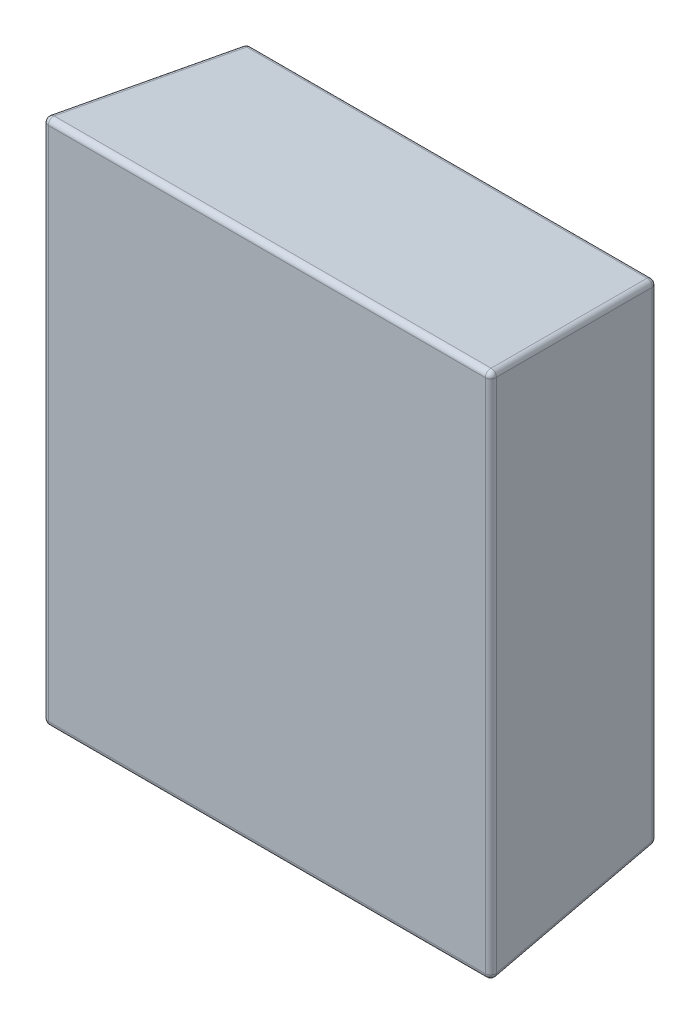
ISO-10303-21;
HEADER;
FILE_DESCRIPTION(('STEP AP214'),'2;1');
FILE_NAME('part.step','',(''),(''),'','','');
FILE_SCHEMA(('AUTOMOTIVE_DESIGN { 1 0 10303 214 1 1 1 1 }'));
ENDSEC;
DATA;
#1=APPLICATION_CONTEXT('core data for automotive mechanical design processes');
#2=APPLICATION_PROTOCOL_DEFINITION('international standard','automotive_design',2000,#1);
#3=PRODUCT_CONTEXT('',#1,'mechanical');
#4=PRODUCT('Part','Part','',(#3));
#5=PRODUCT_RELATED_PRODUCT_CATEGORY('part','',(#4));
#6=PRODUCT_DEFINITION_FORMATION('','',#4);
#7=PRODUCT_DEFINITION_CONTEXT('part definition',#1,'design');
#8=PRODUCT_DEFINITION('design','',#6,#7);
#9=PRODUCT_DEFINITION_SHAPE('','',#8);
#10=(LENGTH_UNIT() NAMED_UNIT(*) SI_UNIT(.MILLI.,.METRE.));
#11=(NAMED_UNIT(*) PLANE_ANGLE_UNIT() SI_UNIT($,.RADIAN.));
#12=(NAMED_UNIT(*) SI_UNIT($,.STERADIAN.) SOLID_ANGLE_UNIT());
#13=UNCERTAINTY_MEASURE_WITH_UNIT(LENGTH_MEASURE(1.E-05),#10,'distance_accuracy_value','');
#14=(GEOMETRIC_REPRESENTATION_CONTEXT(3) GLOBAL_UNCERTAINTY_ASSIGNED_CONTEXT((#13)) GLOBAL_UNIT_ASSIGNED_CONTEXT((#10,
#11,#12)) REPRESENTATION_CONTEXT('',''));
#15=CARTESIAN_POINT('',(0.,0.,0.));
#16=DIRECTION('',(0.,0.,1.));
#17=DIRECTION('',(1.,0.,0.));
#18=AXIS2_PLACEMENT_3D('',#15,#16,#17);
#19=CARTESIAN_POINT('',(26.6055354697207,-0.0356973900736135,-0.664999025911949));
#20=DIRECTION('',(0.,8.74227339409095E-08,-1.));
#21=DIRECTION('',(1.,0.,0.));
#22=AXIS2_PLACEMENT_3D('',#19,#20,#21);
#23=PLANE('',#22);
#24=CARTESIAN_POINT('',(26.6055354697207,-0.0356973900736135,-0.664999025911949));
#25=DIRECTION('',(0.,8.74227339409095E-08,-1.));
#26=DIRECTION('',(1.,0.,0.));
#27=AXIS2_PLACEMENT_3D('',#24,#25,#26);
#28=CIRCLE('',#27,0.10625);
#29=CARTESIAN_POINT('',(26.7117854697207,-0.0356973900736135,-0.664999025911949));
#30=VERTEX_POINT('',#29);
#31=EDGE_CURVE('E20',#30,#30,#28,.T.);
#32=ORIENTED_EDGE('',*,*,#31,.T.);
#33=EDGE_LOOP('',(#32));
#34=FACE_BOUND('',#33,.T.);
#35=ADVANCED_FACE('F17',(#34),#23,.T.);
#36=CARTESIAN_POINT('',(27.9306210908157,1.58938823233279,-0.679998883842521));
#37=DIRECTION('',(0.,-8.74227249203474E-08,1.));
#38=DIRECTION('',(1.,0.,0.));
#39=AXIS2_PLACEMENT_3D('',#36,#37,#38);
#40=SPHERICAL_SURFACE('',#39,0.02);
#41=CARTESIAN_POINT('',(27.9306210908157,1.58938823233279,-0.679998883842521));
#42=DIRECTION('',(0.,-1.,-8.74227249203474E-08));
#43=DIRECTION('',(1.,0.,0.));
#44=AXIS2_PLACEMENT_3D('',#41,#42,#43);
#45=CIRCLE('',#44,0.02);
#46=CARTESIAN_POINT('',(27.9306210908157,1.58938823408125,-0.699998883842521));
#47=VERTEX_POINT('',#46);
#48=CARTESIAN_POINT('',(27.9505115287227,1.58938823251556,-0.682089453107521));
#49=VERTEX_POINT('',#48);
#50=EDGE_CURVE('E373',#47,#49,#45,.T.);
#51=ORIENTED_EDGE('',*,*,#50,.F.);
#52=CARTESIAN_POINT('',(27.9306210908157,1.58938823233279,-0.679998883842521));
#53=DIRECTION('',(1.,0.,0.));
#54=DIRECTION('',(0.,1.,8.74227249203474E-08));
#55=AXIS2_PLACEMENT_3D('',#52,#53,#54);
#56=CIRCLE('',#55,0.02);
#57=CARTESIAN_POINT('',(27.9306210908157,1.60927867042293,-0.682089451368645));
#58=VERTEX_POINT('',#57);
#59=EDGE_CURVE('E385',#47,#58,#56,.T.);
#60=ORIENTED_EDGE('',*,*,#59,.T.);
#61=CARTESIAN_POINT('',(27.9306210908157,1.58938823233279,-0.679998883842521));
#62=DIRECTION('',(0.103962051184974,0.103961964712276,0.989132853466398));
#63=DIRECTION('',(0.994521895368232,9.13814335389409E-09,-0.104528463268024));
#64=AXIS2_PLACEMENT_3D('',#61,#62,#63);
#65=CIRCLE('',#64,0.02);
#66=EDGE_CURVE('E401',#49,#58,#65,.T.);
#67=ORIENTED_EDGE('',*,*,#66,.F.);
#68=EDGE_LOOP('',(#51,#60,#67));
#69=FACE_BOUND('',#68,.T.);
#70=ADVANCED_FACE('F451',(#69),#40,.T.);
#71=CARTESIAN_POINT('',(27.9999898860907,1.65875696990913,-0.019998877778113));
#72=DIRECTION('',(0.,8.74227346347989E-08,-1.));
#73=DIRECTION('',(1.,0.,0.));
#74=AXIS2_PLACEMENT_3D('',#71,#72,#73);
#75=SPHERICAL_SURFACE('',#74,0.02);
#76=CARTESIAN_POINT('',(27.9999898860907,1.65875696990913,-0.019998877778113));
#77=DIRECTION('',(0.103962051183995,0.103961964711298,0.989132853466604));
#78=DIRECTION('',(0.994521895368336,9.13825514806204E-09,-0.104528463267035));
#79=AXIS2_PLACEMENT_3D('',#76,#77,#78);
#80=CIRCLE('',#79,0.02);
#81=CARTESIAN_POINT('',(28.0198803239987,1.6587569700919,-0.0220894470434629));
#82=VERTEX_POINT('',#81);
#83=CARTESIAN_POINT('',(27.9999898860907,1.67864740799925,-0.0220894453045865));
#84=VERTEX_POINT('',#83);
#85=EDGE_CURVE('E27',#82,#84,#80,.T.);
#86=ORIENTED_EDGE('',*,*,#85,.T.);
#87=CARTESIAN_POINT('',(27.9999898860907,1.65875696990913,-0.019998877778113));
#88=DIRECTION('',(-1.,0.,0.));
#89=DIRECTION('',(0.,1.,8.74227346347989E-08));
#90=AXIS2_PLACEMENT_3D('',#87,#88,#89);
#91=CIRCLE('',#90,0.02);
#92=CARTESIAN_POINT('',(27.9999898860907,1.65875696816068,1.12222188703229E-06));
#93=VERTEX_POINT('',#92);
#94=EDGE_CURVE('E346',#93,#84,#91,.T.);
#95=ORIENTED_EDGE('',*,*,#94,.F.);
#96=CARTESIAN_POINT('',(27.9999898860907,1.65875696990913,-0.019998877778113));
#97=DIRECTION('',(0.,1.,8.74227346347989E-08));
#98=DIRECTION('',(1.,0.,0.));
#99=AXIS2_PLACEMENT_3D('',#96,#97,#98);
#100=CIRCLE('',#99,0.02);
#101=EDGE_CURVE('E355',#93,#82,#100,.T.);
#102=ORIENTED_EDGE('',*,*,#101,.T.);
#103=EDGE_LOOP('',(#86,#95,#102));
#104=FACE_BOUND('',#103,.T.);
#105=ADVANCED_FACE('F455',(#104),#75,.T.);
#106=CARTESIAN_POINT('',(28.0222021363877,1.68096921845725,1.12416374256283E-06));
#107=DIRECTION('',(-0.994521895368232,-9.13816403353264E-09,0.104528463268024));
#108=DIRECTION('',(0.,-1.,-8.74227339409095E-08));
#109=AXIS2_PLACEMENT_3D('',#106,#107,#108);
#110=PLANE('',#109);
#111=DIRECTION('',(0.,-1.,-8.74227339409095E-08));
#112=VECTOR('',#111,1.);
#113=CARTESIAN_POINT('',(27.9505115287227,1.60739631340151,-0.682089451533206));
#114=LINE('',#113,#112);
#115=CARTESIAN_POINT('',(27.9505115287227,-0.227449676340516,-0.682089611940458));
#116=VERTEX_POINT('',#115);
#117=EDGE_CURVE('E374',#49,#116,#114,.T.);
#118=ORIENTED_EDGE('',*,*,#117,.F.);
#119=DIRECTION('',(-0.103962051183995,-0.103961964711298,-0.989132853466604));
#120=VECTOR('',#119,1.);
#121=CARTESIAN_POINT('',(28.0224171143907,1.66129375837387,0.00204650151184888));
#122=LINE('',#121,#120);
#123=EDGE_CURVE('E11',#82,#49,#122,.T.);
#124=ORIENTED_EDGE('',*,*,#123,.F.);
#125=DIRECTION('',(0.,-1.,-8.74227339409095E-08));
#126=VECTOR('',#125,1.);
#127=CARTESIAN_POINT('',(28.0198803239987,1.68096922038846,-0.0220894451016074));
#128=LINE('',#127,#126);
#129=CARTESIAN_POINT('',(28.0198803239987,-0.296818529314527,-0.0220896180052198));
#130=VERTEX_POINT('',#129);
#131=EDGE_CURVE('E354',#82,#130,#128,.T.);
#132=ORIENTED_EDGE('',*,*,#131,.T.);
#133=DIRECTION('',(-0.103962051183995,0.103962137656693,-0.989132835289311));
#134=VECTOR('',#133,1.);
#135=CARTESIAN_POINT('',(28.0224171143907,-0.299355321816547,0.00204633010654617));
#136=LINE('',#135,#134);
#137=EDGE_CURVE('E347',#130,#116,#136,.T.);
#138=ORIENTED_EDGE('',*,*,#137,.T.);
#139=EDGE_LOOP('',(#118,#124,#132,#138));
#140=FACE_BOUND('',#139,.T.);
#141=ADVANCED_FACE('F460',(#140),#110,.F.);
#142=CARTESIAN_POINT('',(27.9306210908157,-0.227449676523286,-0.679999042675458));
#143=DIRECTION('',(0.,-8.74227228386792E-08,1.));
#144=DIRECTION('',(0.,-1.,-8.74227228386792E-08));
#145=AXIS2_PLACEMENT_3D('',#142,#143,#144);
#146=SPHERICAL_SURFACE('',#145,0.02);
#147=CARTESIAN_POINT('',(27.9306210908157,-0.227449676523286,-0.679999042675458));
#148=DIRECTION('',(-1.,0.,0.));
#149=DIRECTION('',(0.,-1.,-8.74227228386792E-08));
#150=AXIS2_PLACEMENT_3D('',#147,#148,#149);
#151=CIRCLE('',#150,0.02);
#152=CARTESIAN_POINT('',(27.9306210908157,-0.227449674774824,-0.699999042675458));
#153=VERTEX_POINT('',#152);
#154=CARTESIAN_POINT('',(27.9306210908157,-0.247340114247513,-0.682089613679335));
#155=VERTEX_POINT('',#154);
#156=EDGE_CURVE('E361',#153,#155,#151,.T.);
#157=ORIENTED_EDGE('',*,*,#156,.F.);
#158=CARTESIAN_POINT('',(27.9306210908157,-0.227449676523286,-0.679999042675458));
#159=DIRECTION('',(0.,-1.,-8.74227228386792E-08));
#160=DIRECTION('',(1.,0.,0.));
#161=AXIS2_PLACEMENT_3D('',#158,#159,#160);
#162=CIRCLE('',#161,0.02);
#163=EDGE_CURVE('E370',#153,#116,#162,.T.);
#164=ORIENTED_EDGE('',*,*,#163,.T.);
#165=CARTESIAN_POINT('',(27.9306210908157,-0.227449676523286,-0.679999042675458));
#166=DIRECTION('',(0.103962051184974,-0.103962137657671,0.989132835289105));
#167=DIRECTION('',(0.,-0.994521886230068,-0.104528550211847));
#168=AXIS2_PLACEMENT_3D('',#165,#166,#167);
#169=CIRCLE('',#168,0.02);
#170=EDGE_CURVE('E367',#155,#116,#169,.T.);
#171=ORIENTED_EDGE('',*,*,#170,.F.);
#172=EDGE_LOOP('',(#157,#164,#171));
#173=FACE_BOUND('',#172,.T.);
#174=ADVANCED_FACE('F466',(#173),#146,.T.);
#175=CARTESIAN_POINT('',(27.9999898860907,-0.296818529497283,-0.0199990487398695));
#176=DIRECTION('',(0.,8.74227339409095E-08,-1.));
#177=DIRECTION('',(0.,-1.,-8.74227339409095E-08));
#178=AXIS2_PLACEMENT_3D('',#175,#176,#177);
#179=SPHERICAL_SURFACE('',#178,0.02);
#180=CARTESIAN_POINT('',(27.9999898860907,-0.296818529497283,-0.0199990487398695));
#181=DIRECTION('',(0.103962051183995,-0.103962137656693,0.989132835289311));
#182=DIRECTION('',(1.02612363051035E-13,-0.994521886230172,-0.104528550210858));
#183=AXIS2_PLACEMENT_3D('',#180,#181,#182);
#184=CIRCLE('',#183,0.02);
#185=CARTESIAN_POINT('',(27.9999898860907,-0.316708967222523,-0.0220896197440962));
#186=VERTEX_POINT('',#185);
#187=EDGE_CURVE('E342',#186,#130,#184,.T.);
#188=ORIENTED_EDGE('',*,*,#187,.T.);
#189=CARTESIAN_POINT('',(27.9999898860907,-0.296818529497283,-0.0199990487398695));
#190=DIRECTION('',(0.,1.,8.74227339409095E-08));
#191=DIRECTION('',(1.,0.,0.));
#192=AXIS2_PLACEMENT_3D('',#189,#190,#191);
#193=CIRCLE('',#192,0.02);
#194=CARTESIAN_POINT('',(27.9999898860907,-0.296818531245732,9.51260130128279E-07));
#195=VERTEX_POINT('',#194);
#196=EDGE_CURVE('E350',#195,#130,#193,.T.);
#197=ORIENTED_EDGE('',*,*,#196,.F.);
#198=CARTESIAN_POINT('',(27.9999898860907,-0.296818529497283,-0.0199990487398695));
#199=DIRECTION('',(1.,0.,0.));
#200=DIRECTION('',(0.,-1.,-8.74227339409095E-08));
#201=AXIS2_PLACEMENT_3D('',#198,#199,#200);
#202=CIRCLE('',#201,0.02);
#203=EDGE_CURVE('E315',#195,#186,#202,.T.);
#204=ORIENTED_EDGE('',*,*,#203,.T.);
#205=EDGE_LOOP('',(#188,#197,#204));
#206=FACE_BOUND('',#205,.T.);
#207=ADVANCED_FACE('F448',(#206),#179,.T.);
#208=CARTESIAN_POINT('',(28.0025266764827,1.6612937581911,0.00413707077720222));
#209=DIRECTION('',(-0.103962051183995,-0.103961964711298,-0.989132853466604));
#210=DIRECTION('',(0.994521895368336,9.13825566847908E-09,-0.104528463267035));
#211=AXIS2_PLACEMENT_3D('',#208,#209,#210);
#212=CYLINDRICAL_SURFACE('',#211,0.02);
#213=ORIENTED_EDGE('',*,*,#66,.T.);
#214=DIRECTION('',(-0.103962051183995,-0.103961964711298,-0.989132853466604));
#215=VECTOR('',#214,1.);
#216=CARTESIAN_POINT('',(28.0025266764827,1.68118419628125,0.00204650325072572));
#217=LINE('',#216,#215);
#218=EDGE_CURVE('E303',#84,#58,#217,.T.);
#219=ORIENTED_EDGE('',*,*,#218,.F.);
#220=ORIENTED_EDGE('',*,*,#85,.F.);
#221=ORIENTED_EDGE('',*,*,#123,.T.);
#222=EDGE_LOOP('',(#213,#219,#220,#221));
#223=FACE_BOUND('',#222,.T.);
#224=ADVANCED_FACE('F437',(#223),#212,.T.);
#225=CARTESIAN_POINT('',(26.6055354697207,-0.0356973900736135,-0.664999025911949));
#226=DIRECTION('',(0.,8.74227339409095E-08,-1.));
#227=DIRECTION('',(1.,0.,0.));
#228=AXIS2_PLACEMENT_3D('',#225,#226,#227);
#229=CYLINDRICAL_SURFACE('',#228,0.10625);
#230=CARTESIAN_POINT('',(26.6055354697207,-0.0356973870138389,-0.699999025911949));
#231=DIRECTION('',(0.,8.74227339409095E-08,-1.));
#232=DIRECTION('',(1.,0.,0.));
#233=AXIS2_PLACEMENT_3D('',#230,#231,#232);
#234=CIRCLE('',#233,0.10625);
#235=CARTESIAN_POINT('',(26.7117854697207,-0.0356973870138389,-0.699999025911949));
#236=VERTEX_POINT('',#235);
#237=EDGE_CURVE('E273',#236,#236,#234,.T.);
#238=ORIENTED_EDGE('',*,*,#237,.T.);
#239=EDGE_LOOP('',(#238));
#240=FACE_BOUND('',#239,.T.);
#241=ORIENTED_EDGE('',*,*,#31,.F.);
#242=EDGE_LOOP('',(#241));
#243=FACE_BOUND('',#242,.T.);
#244=ADVANCED_FACE('F434',(#240,#243),#229,.F.);
#245=CARTESIAN_POINT('',(27.9306210908157,1.60739631321874,-0.679998882268205));
#246=DIRECTION('',(0.,-1.,-8.74227339409095E-08));
#247=DIRECTION('',(0.994521895368232,9.13816403353264E-09,-0.104528463268024));
#248=AXIS2_PLACEMENT_3D('',#245,#246,#247);
#249=CYLINDRICAL_SURFACE('',#248,0.02);
#250=ORIENTED_EDGE('',*,*,#117,.T.);
#251=ORIENTED_EDGE('',*,*,#163,.F.);
#252=DIRECTION('',(0.,-1.,-8.74227339409095E-08));
#253=VECTOR('',#252,1.);
#254=CARTESIAN_POINT('',(27.9306210908157,1.6073963149672,-0.699998882268205));
#255=LINE('',#254,#253);
#256=EDGE_CURVE('E274',#47,#153,#255,.T.);
#257=ORIENTED_EDGE('',*,*,#256,.F.);
#258=ORIENTED_EDGE('',*,*,#50,.T.);
#259=EDGE_LOOP('',(#250,#251,#257,#258));
#260=FACE_BOUND('',#259,.T.);
#261=ADVANCED_FACE('F436',(#260),#249,.T.);
#262=CARTESIAN_POINT('',(26.3957751010737,1.58938823233279,-0.679998883842521));
#263=DIRECTION('',(1.,0.,0.));
#264=DIRECTION('',(0.,0.994521904506396,-0.104528376324201));
#265=AXIS2_PLACEMENT_3D('',#262,#263,#264);
#266=CYLINDRICAL_SURFACE('',#265,0.02);
#267=DIRECTION('',(1.,0.,0.));
#268=VECTOR('',#267,1.);
#269=CARTESIAN_POINT('',(26.3957751010737,1.60927867042293,-0.682089451368645));
#270=LINE('',#269,#268);
#271=CARTESIAN_POINT('',(26.4137831819597,1.60927867042293,-0.682089451368645));
#272=VERTEX_POINT('',#271);
#273=EDGE_CURVE('E311',#272,#58,#270,.T.);
#274=ORIENTED_EDGE('',*,*,#273,.T.);
#275=ORIENTED_EDGE('',*,*,#59,.F.);
#276=DIRECTION('',(1.,0.,0.));
#277=VECTOR('',#276,1.);
#278=CARTESIAN_POINT('',(26.3957751010737,1.58938823408125,-0.699998883842521));
#279=LINE('',#278,#277);
#280=CARTESIAN_POINT('',(26.4137831819597,1.58938823408125,-0.699998883842521));
#281=VERTEX_POINT('',#280);
#282=EDGE_CURVE('E318',#281,#47,#279,.T.);
#283=ORIENTED_EDGE('',*,*,#282,.F.);
#284=CARTESIAN_POINT('',(26.4137831819597,1.58938823233279,-0.679998883842521));
#285=DIRECTION('',(1.,0.,0.));
#286=DIRECTION('',(0.,1.,8.74227332470201E-08));
#287=AXIS2_PLACEMENT_3D('',#284,#285,#286);
#288=CIRCLE('',#287,0.02);
#289=EDGE_CURVE('E296',#281,#272,#288,.T.);
#290=ORIENTED_EDGE('',*,*,#289,.T.);
#291=EDGE_LOOP('',(#274,#275,#283,#290));
#292=FACE_BOUND('',#291,.T.);
#293=ADVANCED_FACE('F445',(#292),#266,.T.);
#294=CARTESIAN_POINT('',(27.9999898860907,1.68096922020572,-0.0199988758362575));
#295=DIRECTION('',(0.,-1.,-8.74227339409095E-08));
#296=DIRECTION('',(0.994521895368232,9.13816403353264E-09,-0.104528463268024));
#297=AXIS2_PLACEMENT_3D('',#294,#295,#296);
#298=CYLINDRICAL_SURFACE('',#297,0.02);
#299=ORIENTED_EDGE('',*,*,#101,.F.);
#300=DIRECTION('',(0.,-1.,-8.74227339409095E-08));
#301=VECTOR('',#300,1.);
#302=CARTESIAN_POINT('',(27.9999898860907,1.68096921845725,1.12416374256283E-06));
#303=LINE('',#302,#301);
#304=EDGE_CURVE('E255',#93,#195,#303,.T.);
#305=ORIENTED_EDGE('',*,*,#304,.T.);
#306=ORIENTED_EDGE('',*,*,#196,.T.);
#307=ORIENTED_EDGE('',*,*,#131,.F.);
#308=EDGE_LOOP('',(#299,#305,#306,#307));
#309=FACE_BOUND('',#308,.T.);
#310=ADVANCED_FACE('F482',(#309),#298,.T.);
#311=CARTESIAN_POINT('',(26.3222021363877,1.65875696990913,-0.019998877778113));
#312=DIRECTION('',(1.,0.,0.));
#313=DIRECTION('',(0.,0.994521904506396,-0.104528376324201));
#314=AXIS2_PLACEMENT_3D('',#311,#312,#313);
#315=CYLINDRICAL_SURFACE('',#314,0.02);
#316=CARTESIAN_POINT('',(26.3444143866843,1.65875696990913,-0.019998877778113));
#317=DIRECTION('',(-1.,0.,0.));
#318=DIRECTION('',(0.,1.,8.74227339409095E-08));
#319=AXIS2_PLACEMENT_3D('',#316,#317,#318);
#320=CIRCLE('',#319,0.02);
#321=CARTESIAN_POINT('',(26.3444143866843,1.65875696816068,1.12222188703229E-06));
#322=VERTEX_POINT('',#321);
#323=CARTESIAN_POINT('',(26.3444143866843,1.67864740799925,-0.0220894453045865));
#324=VERTEX_POINT('',#323);
#325=EDGE_CURVE('E247',#322,#324,#320,.T.);
#326=ORIENTED_EDGE('',*,*,#325,.F.);
#327=DIRECTION('',(1.,0.,0.));
#328=VECTOR('',#327,1.);
#329=CARTESIAN_POINT('',(26.3222021363877,1.65875696816068,1.12222188703229E-06));
#330=LINE('',#329,#328);
#331=EDGE_CURVE('E292',#322,#93,#330,.T.);
#332=ORIENTED_EDGE('',*,*,#331,.T.);
#333=ORIENTED_EDGE('',*,*,#94,.T.);
#334=DIRECTION('',(1.,0.,0.));
#335=VECTOR('',#334,1.);
#336=CARTESIAN_POINT('',(26.3222021363877,1.67864740799925,-0.0220894453045865));
#337=LINE('',#336,#335);
#338=EDGE_CURVE('E299',#324,#84,#337,.T.);
#339=ORIENTED_EDGE('',*,*,#338,.F.);
#340=EDGE_LOOP('',(#326,#332,#333,#339));
#341=FACE_BOUND('',#340,.T.);
#342=ADVANCED_FACE('F515',(#341),#315,.T.);
#343=CARTESIAN_POINT('',(28.0025266764827,-0.299355321999317,0.00413689937189908));
#344=DIRECTION('',(-0.103962051183995,0.103962137656693,-0.989132835289311));
#345=DIRECTION('',(0.,-0.994521886230172,-0.104528550210858));
#346=AXIS2_PLACEMENT_3D('',#343,#344,#345);
#347=CYLINDRICAL_SURFACE('',#346,0.02);
#348=ORIENTED_EDGE('',*,*,#170,.T.);
#349=ORIENTED_EDGE('',*,*,#137,.F.);
#350=ORIENTED_EDGE('',*,*,#187,.F.);
#351=DIRECTION('',(-0.103962051183995,0.103962137656693,-0.989132835289311));
#352=VECTOR('',#351,1.);
#353=CARTESIAN_POINT('',(28.0025266764827,-0.319245759724557,0.00204632836766976));
#354=LINE('',#353,#352);
#355=EDGE_CURVE('E248',#186,#155,#354,.T.);
#356=ORIENTED_EDGE('',*,*,#355,.T.);
#357=EDGE_LOOP('',(#348,#349,#350,#356));
#358=FACE_BOUND('',#357,.T.);
#359=ADVANCED_FACE('F478',(#358),#347,.T.);
#360=CARTESIAN_POINT('',(26.3957751010737,-0.227449676523286,-0.679999042675458));
#361=DIRECTION('',(1.,0.,0.));
#362=DIRECTION('',(0.,-0.994521886230068,-0.104528550211847));
#363=AXIS2_PLACEMENT_3D('',#360,#361,#362);
#364=CYLINDRICAL_SURFACE('',#363,0.02);
#365=CARTESIAN_POINT('',(26.4137831819597,-0.227449676523286,-0.679999042675458));
#366=DIRECTION('',(-1.,0.,0.));
#367=DIRECTION('',(0.,-1.,-8.74227339409095E-08));
#368=AXIS2_PLACEMENT_3D('',#365,#366,#367);
#369=CIRCLE('',#368,0.02);
#370=CARTESIAN_POINT('',(26.4137831819597,-0.227449674774824,-0.699999042675458));
#371=VERTEX_POINT('',#370);
#372=CARTESIAN_POINT('',(26.4137831819597,-0.247340114247513,-0.682089613679335));
#373=VERTEX_POINT('',#372);
#374=EDGE_CURVE('E260',#371,#373,#369,.T.);
#375=ORIENTED_EDGE('',*,*,#374,.F.);
#376=DIRECTION('',(1.,0.,0.));
#377=VECTOR('',#376,1.);
#378=CARTESIAN_POINT('',(26.3957751010737,-0.227449674774824,-0.699999042675458));
#379=LINE('',#378,#377);
#380=EDGE_CURVE('E269',#371,#153,#379,.T.);
#381=ORIENTED_EDGE('',*,*,#380,.T.);
#382=ORIENTED_EDGE('',*,*,#156,.T.);
#383=DIRECTION('',(1.,0.,0.));
#384=VECTOR('',#383,1.);
#385=CARTESIAN_POINT('',(26.3957751010737,-0.247340114247513,-0.682089613679335));
#386=LINE('',#385,#384);
#387=EDGE_CURVE('E266',#373,#155,#386,.T.);
#388=ORIENTED_EDGE('',*,*,#387,.F.);
#389=EDGE_LOOP('',(#375,#381,#382,#388));
#390=FACE_BOUND('',#389,.T.);
#391=ADVANCED_FACE('F494',(#390),#364,.T.);
#392=CARTESIAN_POINT('',(26.3222021363877,-0.296818529497283,-0.0199990487398695));
#393=DIRECTION('',(1.,0.,0.));
#394=DIRECTION('',(0.,-0.994521886230068,-0.104528550211847));
#395=AXIS2_PLACEMENT_3D('',#392,#393,#394);
#396=CYLINDRICAL_SURFACE('',#395,0.02);
#397=DIRECTION('',(1.,0.,0.));
#398=VECTOR('',#397,1.);
#399=CARTESIAN_POINT('',(26.3222021363877,-0.316708967222523,-0.0220896197440962));
#400=LINE('',#399,#398);
#401=CARTESIAN_POINT('',(26.3444143866843,-0.316708967222523,-0.0220896197440962));
#402=VERTEX_POINT('',#401);
#403=EDGE_CURVE('E243',#402,#186,#400,.T.);
#404=ORIENTED_EDGE('',*,*,#403,.T.);
#405=ORIENTED_EDGE('',*,*,#203,.F.);
#406=DIRECTION('',(1.,0.,0.));
#407=VECTOR('',#406,1.);
#408=CARTESIAN_POINT('',(26.3222021363877,-0.296818531245732,9.51260130128279E-07));
#409=LINE('',#408,#407);
#410=CARTESIAN_POINT('',(26.3444143866843,-0.296818531245732,9.51260130128279E-07));
#411=VERTEX_POINT('',#410);
#412=EDGE_CURVE('E251',#411,#195,#409,.T.);
#413=ORIENTED_EDGE('',*,*,#412,.F.);
#414=CARTESIAN_POINT('',(26.3444143866843,-0.296818529497283,-0.0199990487398695));
#415=DIRECTION('',(1.,0.,0.));
#416=DIRECTION('',(0.,-1.,-8.74227450431397E-08));
#417=AXIS2_PLACEMENT_3D('',#414,#415,#416);
#418=CIRCLE('',#417,0.02);
#419=EDGE_CURVE('E136',#411,#402,#418,.T.);
#420=ORIENTED_EDGE('',*,*,#419,.T.);
#421=EDGE_LOOP('',(#404,#405,#413,#420));
#422=FACE_BOUND('',#421,.T.);
#423=ADVANCED_FACE('F488',(#422),#396,.T.);
#424=CARTESIAN_POINT('',(26.3222021363877,1.68096921845725,1.12416374256283E-06));
#425=DIRECTION('',(0.,-0.994521904506396,0.104528376324201));
#426=DIRECTION('',(1.,0.,0.));
#427=AXIS2_PLACEMENT_3D('',#424,#425,#426);
#428=PLANE('',#427);
#429=ORIENTED_EDGE('',*,*,#338,.T.);
#430=ORIENTED_EDGE('',*,*,#218,.T.);
#431=ORIENTED_EDGE('',*,*,#273,.F.);
#432=DIRECTION('',(0.103962051183995,-0.103961964711298,-0.989132853466604));
#433=VECTOR('',#432,1.);
#434=CARTESIAN_POINT('',(26.3418775962923,1.68118419628125,0.00204650325072572));
#435=LINE('',#434,#433);
#436=EDGE_CURVE('E215',#324,#272,#435,.T.);
#437=ORIENTED_EDGE('',*,*,#436,.F.);
#438=EDGE_LOOP('',(#429,#430,#431,#437));
#439=FACE_BOUND('',#438,.T.);
#440=ADVANCED_FACE('F512',(#439),#428,.F.);
#441=CARTESIAN_POINT('',(26.3222021363877,1.68096927965317,-0.699998875836256));
#442=DIRECTION('',(0.,8.74227339409095E-08,-1.));
#443=DIRECTION('',(1.,0.,0.));
#444=AXIS2_PLACEMENT_3D('',#441,#442,#443);
#445=PLANE('',#444);
#446=ORIENTED_EDGE('',*,*,#237,.F.);
#447=EDGE_LOOP('',(#446));
#448=FACE_BOUND('',#447,.T.);
#449=DIRECTION('',(0.,-1.,-8.74227339409095E-08));
#450=VECTOR('',#449,1.);
#451=CARTESIAN_POINT('',(26.4137831819597,1.6073963149672,-0.699998882268205));
#452=LINE('',#451,#450);
#453=EDGE_CURVE('E196',#281,#371,#452,.T.);
#454=ORIENTED_EDGE('',*,*,#453,.F.);
#455=ORIENTED_EDGE('',*,*,#282,.T.);
#456=ORIENTED_EDGE('',*,*,#256,.T.);
#457=ORIENTED_EDGE('',*,*,#380,.F.);
#458=EDGE_LOOP('',(#454,#455,#456,#457));
#459=FACE_BOUND('',#458,.T.);
#460=ADVANCED_FACE('F505',(#448,#459),#445,.T.);
#461=CARTESIAN_POINT('',(26.4137831819597,1.58938823233279,-0.679998883842521));
#462=DIRECTION('',(0.,-8.74227332470201E-08,1.));
#463=DIRECTION('',(-1.,0.,0.));
#464=AXIS2_PLACEMENT_3D('',#461,#462,#463);
#465=SPHERICAL_SURFACE('',#464,0.02);
#466=CARTESIAN_POINT('',(26.4137831819597,1.58938823233279,-0.679998883842521));
#467=DIRECTION('',(0.103962051184974,-0.103961964712276,-0.989132853466398));
#468=DIRECTION('',(-0.994521895368232,9.13815227731165E-09,-0.104528463268024));
#469=AXIS2_PLACEMENT_3D('',#466,#467,#468);
#470=CIRCLE('',#469,0.02);
#471=CARTESIAN_POINT('',(26.3938927440523,1.58938823251556,-0.682089453107521));
#472=VERTEX_POINT('',#471);
#473=EDGE_CURVE('E222',#472,#272,#470,.T.);
#474=ORIENTED_EDGE('',*,*,#473,.T.);
#475=ORIENTED_EDGE('',*,*,#289,.F.);
#476=CARTESIAN_POINT('',(26.4137831819597,1.58938823233279,-0.679998883842521));
#477=DIRECTION('',(0.,1.,8.74227332470201E-08));
#478=DIRECTION('',(-1.,0.,0.));
#479=AXIS2_PLACEMENT_3D('',#476,#477,#478);
#480=CIRCLE('',#479,0.02);
#481=EDGE_CURVE('E209',#281,#472,#480,.T.);
#482=ORIENTED_EDGE('',*,*,#481,.T.);
#483=EDGE_LOOP('',(#474,#475,#482));
#484=FACE_BOUND('',#483,.T.);
#485=ADVANCED_FACE('F521',(#484),#465,.T.);
#486=CARTESIAN_POINT('',(26.3222021363877,1.68096921845725,1.12416374256283E-06));
#487=DIRECTION('',(0.,8.74227339409095E-08,-1.));
#488=DIRECTION('',(1.,0.,0.));
#489=AXIS2_PLACEMENT_3D('',#486,#487,#488);
#490=PLANE('',#489);
#491=ORIENTED_EDGE('',*,*,#412,.T.);
#492=ORIENTED_EDGE('',*,*,#304,.F.);
#493=ORIENTED_EDGE('',*,*,#331,.F.);
#494=DIRECTION('',(0.,-1.,-8.74227339409095E-08));
#495=VECTOR('',#494,1.);
#496=CARTESIAN_POINT('',(26.3444143866843,1.68096921845725,1.12416374256283E-06));
#497=LINE('',#496,#495);
#498=EDGE_CURVE('E142',#322,#411,#497,.T.);
#499=ORIENTED_EDGE('',*,*,#498,.T.);
#500=EDGE_LOOP('',(#491,#492,#493,#499));
#501=FACE_BOUND('',#500,.T.);
#502=ADVANCED_FACE('F486',(#501),#490,.F.);
#503=CARTESIAN_POINT('',(26.3444143866843,1.65875696990913,-0.019998877778113));
#504=DIRECTION('',(0.,8.74227339409095E-08,-1.));
#505=DIRECTION('',(-1.,0.,0.));
#506=AXIS2_PLACEMENT_3D('',#503,#504,#505);
#507=SPHERICAL_SURFACE('',#506,0.02);
#508=CARTESIAN_POINT('',(26.3444143866843,1.65875696990913,-0.019998877778113));
#509=DIRECTION('',(0.,-1.,-8.74227339409095E-08));
#510=DIRECTION('',(-1.,0.,0.));
#511=AXIS2_PLACEMENT_3D('',#508,#509,#510);
#512=CIRCLE('',#511,0.02);
#513=CARTESIAN_POINT('',(26.3245239487769,1.6587569700919,-0.0220894470434629));
#514=VERTEX_POINT('',#513);
#515=EDGE_CURVE('E159',#322,#514,#512,.T.);
#516=ORIENTED_EDGE('',*,*,#515,.F.);
#517=ORIENTED_EDGE('',*,*,#325,.T.);
#518=CARTESIAN_POINT('',(26.3444143866843,1.65875696990913,-0.019998877778113));
#519=DIRECTION('',(0.103962051183995,-0.103961964711298,-0.989132853466604));
#520=DIRECTION('',(-0.994521895368336,9.13825566847908E-09,-0.104528463267035));
#521=AXIS2_PLACEMENT_3D('',#518,#519,#520);
#522=CIRCLE('',#521,0.02);
#523=EDGE_CURVE('E195',#514,#324,#522,.T.);
#524=ORIENTED_EDGE('',*,*,#523,.F.);
#525=EDGE_LOOP('',(#516,#517,#524));
#526=FACE_BOUND('',#525,.T.);
#527=ADVANCED_FACE('F517',(#526),#507,.T.);
#528=CARTESIAN_POINT('',(26.3222021363877,-0.319030781542745,9.49318274597738E-07));
#529=DIRECTION('',(0.,-0.994521886230068,-0.104528550211847));
#530=DIRECTION('',(1.,0.,0.));
#531=AXIS2_PLACEMENT_3D('',#528,#529,#530);
#532=PLANE('',#531);
#533=DIRECTION('',(0.103962051183995,0.103962137656693,-0.989132835289311));
#534=VECTOR('',#533,1.);
#535=CARTESIAN_POINT('',(26.3418775962923,-0.319245759724557,0.00204632836766976));
#536=LINE('',#535,#534);
#537=EDGE_CURVE('E151',#402,#373,#536,.T.);
#538=ORIENTED_EDGE('',*,*,#537,.T.);
#539=ORIENTED_EDGE('',*,*,#387,.T.);
#540=ORIENTED_EDGE('',*,*,#355,.F.);
#541=ORIENTED_EDGE('',*,*,#403,.F.);
#542=EDGE_LOOP('',(#538,#539,#540,#541));
#543=FACE_BOUND('',#542,.T.);
#544=ADVANCED_FACE('F491',(#543),#532,.T.);
#545=CARTESIAN_POINT('',(26.4137831819597,-0.227449676523286,-0.679999042675458));
#546=DIRECTION('',(0.,-8.74227339409095E-08,1.));
#547=DIRECTION('',(-1.,0.,0.));
#548=AXIS2_PLACEMENT_3D('',#545,#546,#547);
#549=SPHERICAL_SURFACE('',#548,0.02);
#550=CARTESIAN_POINT('',(26.4137831819597,-0.227449676523286,-0.679999042675458));
#551=DIRECTION('',(0.,1.,8.74227339409095E-08));
#552=DIRECTION('',(-1.,0.,0.));
#553=AXIS2_PLACEMENT_3D('',#550,#551,#552);
#554=CIRCLE('',#553,0.02);
#555=CARTESIAN_POINT('',(26.3938927440523,-0.227449676340516,-0.682089611940458));
#556=VERTEX_POINT('',#555);
#557=EDGE_CURVE('E192',#371,#556,#554,.T.);
#558=ORIENTED_EDGE('',*,*,#557,.F.);
#559=ORIENTED_EDGE('',*,*,#374,.T.);
#560=CARTESIAN_POINT('',(26.4137831819597,-0.227449676523286,-0.679999042675458));
#561=DIRECTION('',(-0.103962051183985,-0.103962137657682,0.989132835289208));
#562=DIRECTION('',(-0.994521895368336,9.13807239841329E-09,-0.104528463267035));
#563=AXIS2_PLACEMENT_3D('',#560,#561,#562);
#564=CIRCLE('',#563,0.02);
#565=EDGE_CURVE('E181',#556,#373,#564,.T.);
#566=ORIENTED_EDGE('',*,*,#565,.F.);
#567=EDGE_LOOP('',(#558,#559,#566));
#568=FACE_BOUND('',#567,.T.);
#569=ADVANCED_FACE('F499',(#568),#549,.T.);
#570=CARTESIAN_POINT('',(26.3444143866843,-0.296818529497283,-0.0199990487398695));
#571=DIRECTION('',(0.,8.74227450431397E-08,-1.));
#572=DIRECTION('',(-1.,0.,0.));
#573=AXIS2_PLACEMENT_3D('',#570,#571,#572);
#574=SPHERICAL_SURFACE('',#573,0.02);
#575=CARTESIAN_POINT('',(26.3444143866843,-0.296818529497283,-0.0199990487398695));
#576=DIRECTION('',(-0.103962051183995,-0.103962137656693,0.989132835289311));
#577=DIRECTION('',(-0.994521895368336,9.13806141934841E-09,-0.104528463267035));
#578=AXIS2_PLACEMENT_3D('',#575,#576,#577);
#579=CIRCLE('',#578,0.02);
#580=CARTESIAN_POINT('',(26.3245239487769,-0.296818529314527,-0.0220896180052198));
#581=VERTEX_POINT('',#580);
#582=EDGE_CURVE('E133',#581,#402,#579,.T.);
#583=ORIENTED_EDGE('',*,*,#582,.T.);
#584=ORIENTED_EDGE('',*,*,#419,.F.);
#585=CARTESIAN_POINT('',(26.3444143866843,-0.296818529497283,-0.0199990487398695));
#586=DIRECTION('',(0.,-1.,-8.74227450431397E-08));
#587=DIRECTION('',(-1.,0.,0.));
#588=AXIS2_PLACEMENT_3D('',#585,#586,#587);
#589=CIRCLE('',#588,0.02);
#590=EDGE_CURVE('E130',#411,#581,#589,.T.);
#591=ORIENTED_EDGE('',*,*,#590,.T.);
#592=EDGE_LOOP('',(#583,#584,#591));
#593=FACE_BOUND('',#592,.T.);
#594=ADVANCED_FACE('F132',(#593),#574,.T.);
#595=CARTESIAN_POINT('',(26.3418775962923,1.6612937581911,0.00413707077720222));
#596=DIRECTION('',(0.103962051183995,-0.103961964711298,-0.989132853466604));
#597=DIRECTION('',(-0.994521895368336,9.13825566847908E-09,-0.104528463267035));
#598=AXIS2_PLACEMENT_3D('',#595,#596,#597);
#599=CYLINDRICAL_SURFACE('',#598,0.02);
#600=DIRECTION('',(0.103962051183995,-0.103961964711298,-0.989132853466604));
#601=VECTOR('',#600,1.);
#602=CARTESIAN_POINT('',(26.3219871583849,1.66129375837387,0.00204650151184888));
#603=LINE('',#602,#601);
#604=EDGE_CURVE('E164',#514,#472,#603,.T.);
#605=ORIENTED_EDGE('',*,*,#604,.F.);
#606=ORIENTED_EDGE('',*,*,#523,.T.);
#607=ORIENTED_EDGE('',*,*,#436,.T.);
#608=ORIENTED_EDGE('',*,*,#473,.F.);
#609=EDGE_LOOP('',(#605,#606,#607,#608));
#610=FACE_BOUND('',#609,.T.);
#611=ADVANCED_FACE('F519',(#610),#599,.T.);
#612=CARTESIAN_POINT('',(26.4137831819597,1.60739631321874,-0.679998882268205));
#613=DIRECTION('',(0.,-1.,-8.74227339409095E-08));
#614=DIRECTION('',(-0.994521895368232,9.13816403353264E-09,-0.104528463268024));
#615=AXIS2_PLACEMENT_3D('',#612,#613,#614);
#616=CYLINDRICAL_SURFACE('',#615,0.02);
#617=ORIENTED_EDGE('',*,*,#481,.F.);
#618=ORIENTED_EDGE('',*,*,#453,.T.);
#619=ORIENTED_EDGE('',*,*,#557,.T.);
#620=DIRECTION('',(0.,-1.,-8.74227339409095E-08));
#621=VECTOR('',#620,1.);
#622=CARTESIAN_POINT('',(26.3938927440523,1.60739631340151,-0.682089451533206));
#623=LINE('',#622,#621);
#624=EDGE_CURVE('E169',#472,#556,#623,.T.);
#625=ORIENTED_EDGE('',*,*,#624,.F.);
#626=EDGE_LOOP('',(#617,#618,#619,#625));
#627=FACE_BOUND('',#626,.T.);
#628=ADVANCED_FACE('F503',(#627),#616,.T.);
#629=CARTESIAN_POINT('',(26.3444143866843,1.68096922020572,-0.0199988758362575));
#630=DIRECTION('',(0.,-1.,-8.74227339409095E-08));
#631=DIRECTION('',(-0.994521895368232,9.13816403353264E-09,-0.104528463268024));
#632=AXIS2_PLACEMENT_3D('',#629,#630,#631);
#633=CYLINDRICAL_SURFACE('',#632,0.02);
#634=DIRECTION('',(0.,-1.,-8.74227339409095E-08));
#635=VECTOR('',#634,1.);
#636=CARTESIAN_POINT('',(26.3245239487769,1.68096922038846,-0.0220894451016074));
#637=LINE('',#636,#635);
#638=EDGE_CURVE('E156',#514,#581,#637,.T.);
#639=ORIENTED_EDGE('',*,*,#638,.T.);
#640=ORIENTED_EDGE('',*,*,#590,.F.);
#641=ORIENTED_EDGE('',*,*,#498,.F.);
#642=ORIENTED_EDGE('',*,*,#515,.T.);
#643=EDGE_LOOP('',(#639,#640,#641,#642));
#644=FACE_BOUND('',#643,.T.);
#645=ADVANCED_FACE('F157',(#644),#633,.T.);
#646=CARTESIAN_POINT('',(26.3418775962923,-0.299355321999317,0.00413689937189908));
#647=DIRECTION('',(0.103962051183995,0.103962137656693,-0.989132835289311));
#648=DIRECTION('',(-0.994521895368336,9.13807239841329E-09,-0.104528463267035));
#649=AXIS2_PLACEMENT_3D('',#646,#647,#648);
#650=CYLINDRICAL_SURFACE('',#649,0.02);
#651=ORIENTED_EDGE('',*,*,#565,.T.);
#652=ORIENTED_EDGE('',*,*,#537,.F.);
#653=ORIENTED_EDGE('',*,*,#582,.F.);
#654=DIRECTION('',(0.103962051183995,0.103962137656693,-0.989132835289311));
#655=VECTOR('',#654,1.);
#656=CARTESIAN_POINT('',(26.3219871583849,-0.299355321816547,0.00204633010654617));
#657=LINE('',#656,#655);
#658=EDGE_CURVE('E149',#581,#556,#657,.T.);
#659=ORIENTED_EDGE('',*,*,#658,.T.);
#660=EDGE_LOOP('',(#651,#652,#653,#659));
#661=FACE_BOUND('',#660,.T.);
#662=ADVANCED_FACE('F147',(#661),#650,.T.);
#663=CARTESIAN_POINT('',(26.3222021363877,1.68096921845725,1.12416374256283E-06));
#664=DIRECTION('',(-0.994521895368232,9.13816403353264E-09,-0.104528463268024));
#665=DIRECTION('',(0.,-1.,-8.74227339409095E-08));
#666=AXIS2_PLACEMENT_3D('',#663,#664,#665);
#667=PLANE('',#666);
#668=ORIENTED_EDGE('',*,*,#658,.F.);
#669=ORIENTED_EDGE('',*,*,#638,.F.);
#670=ORIENTED_EDGE('',*,*,#604,.T.);
#671=ORIENTED_EDGE('',*,*,#624,.T.);
#672=EDGE_LOOP('',(#668,#669,#670,#671));
#673=FACE_BOUND('',#672,.T.);
#674=ADVANCED_FACE('F167',(#673),#667,.T.);
#675=CLOSED_SHELL('',(#35,#70,#105,#141,#174,#207,#224,#244,#261,#293,#310,#342,#359,#391,#423,
#440,#460,#485,#502,#527,#544,#569,#594,#611,#628,#645,#662,#674));
#676=MANIFOLD_SOLID_BREP('B1',#675);
#677=ADVANCED_BREP_SHAPE_REPRESENTATION('',(#18,#676),#14);
#678=SHAPE_DEFINITION_REPRESENTATION(#9,#677);
ENDSEC;
END-ISO-10303-21;
